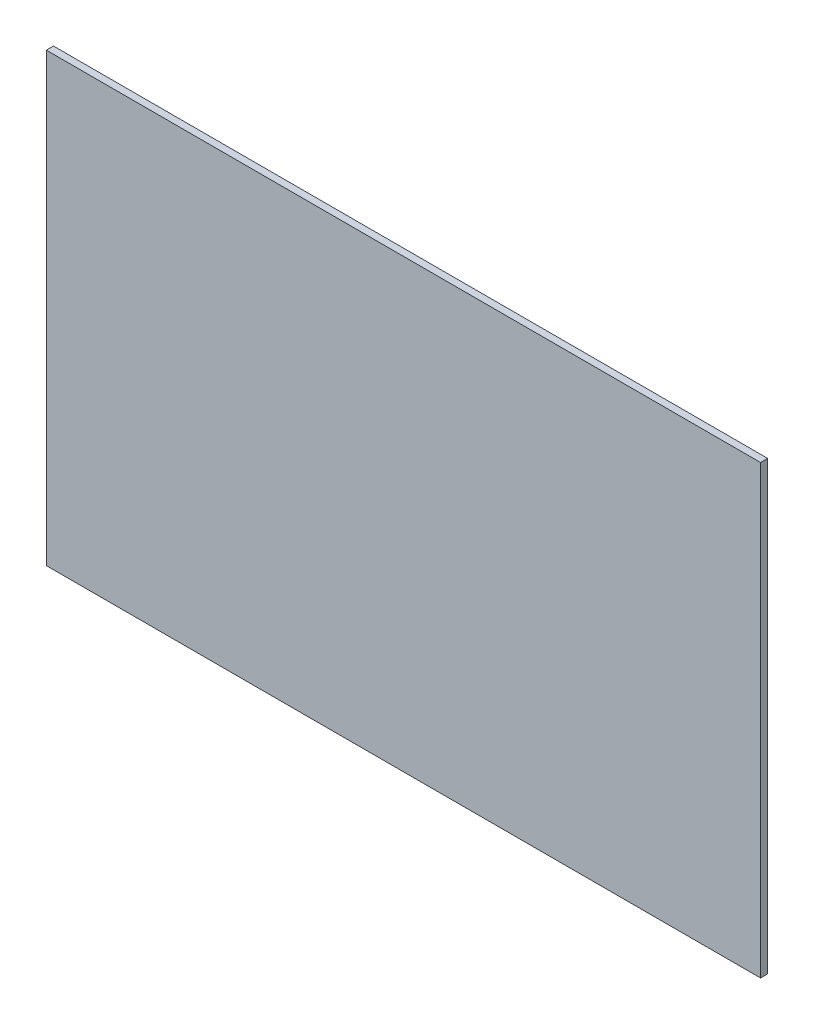
ISO-10303-21;
HEADER;
FILE_DESCRIPTION(('STEP AP214'),'2;1');
FILE_NAME('part.step','',(''),(''),'','','');
FILE_SCHEMA(('AUTOMOTIVE_DESIGN { 1 0 10303 214 1 1 1 1 }'));
ENDSEC;
DATA;
#1=APPLICATION_CONTEXT('core data for automotive mechanical design processes');
#2=APPLICATION_PROTOCOL_DEFINITION('international standard','automotive_design',2000,#1);
#3=PRODUCT_CONTEXT('',#1,'mechanical');
#4=PRODUCT('Part','Part','',(#3));
#5=PRODUCT_RELATED_PRODUCT_CATEGORY('part','',(#4));
#6=PRODUCT_DEFINITION_FORMATION('','',#4);
#7=PRODUCT_DEFINITION_CONTEXT('part definition',#1,'design');
#8=PRODUCT_DEFINITION('design','',#6,#7);
#9=PRODUCT_DEFINITION_SHAPE('','',#8);
#10=(LENGTH_UNIT() NAMED_UNIT(*) SI_UNIT(.MILLI.,.METRE.));
#11=(NAMED_UNIT(*) PLANE_ANGLE_UNIT() SI_UNIT($,.RADIAN.));
#12=(NAMED_UNIT(*) SI_UNIT($,.STERADIAN.) SOLID_ANGLE_UNIT());
#13=UNCERTAINTY_MEASURE_WITH_UNIT(LENGTH_MEASURE(1.E-05),#10,'distance_accuracy_value','');
#14=(GEOMETRIC_REPRESENTATION_CONTEXT(3) GLOBAL_UNCERTAINTY_ASSIGNED_CONTEXT((#13)) GLOBAL_UNIT_ASSIGNED_CONTEXT((#10,
#11,#12)) REPRESENTATION_CONTEXT('',''));
#15=CARTESIAN_POINT('',(0.,0.,0.));
#16=DIRECTION('',(0.,0.,1.));
#17=DIRECTION('',(1.,0.,0.));
#18=AXIS2_PLACEMENT_3D('',#15,#16,#17);
#19=CARTESIAN_POINT('',(0.,0.,0.508));
#20=DIRECTION('',(1.,0.,0.));
#21=DIRECTION('',(0.,1.,0.));
#22=AXIS2_PLACEMENT_3D('',#19,#20,#21);
#23=PLANE('',#22);
#24=DIRECTION('',(0.,-1.,0.));
#25=VECTOR('',#24,1.);
#26=CARTESIAN_POINT('',(0.,0.,0.));
#27=LINE('',#26,#25);
#28=CARTESIAN_POINT('',(0.,31.75,0.));
#29=VERTEX_POINT('',#28);
#30=CARTESIAN_POINT('',(0.,0.,0.));
#31=VERTEX_POINT('',#30);
#32=EDGE_CURVE('E107',#29,#31,#27,.T.);
#33=ORIENTED_EDGE('',*,*,#32,.T.);
#34=DIRECTION('',(0.,0.,-1.));
#35=VECTOR('',#34,1.);
#36=CARTESIAN_POINT('',(0.,0.,0.508));
#37=LINE('',#36,#35);
#38=CARTESIAN_POINT('',(0.,0.,0.508));
#39=VERTEX_POINT('',#38);
#40=EDGE_CURVE('E11',#39,#31,#37,.T.);
#41=ORIENTED_EDGE('',*,*,#40,.F.);
#42=DIRECTION('',(0.,-1.,0.));
#43=VECTOR('',#42,1.);
#44=CARTESIAN_POINT('',(0.,0.,0.508));
#45=LINE('',#44,#43);
#46=CARTESIAN_POINT('',(0.,31.75,0.508));
#47=VERTEX_POINT('',#46);
#48=EDGE_CURVE('E91',#47,#39,#45,.T.);
#49=ORIENTED_EDGE('',*,*,#48,.F.);
#50=DIRECTION('',(0.,0.,-1.));
#51=VECTOR('',#50,1.);
#52=CARTESIAN_POINT('',(0.,31.75,0.508));
#53=LINE('',#52,#51);
#54=EDGE_CURVE('E103',#47,#29,#53,.T.);
#55=ORIENTED_EDGE('',*,*,#54,.T.);
#56=EDGE_LOOP('',(#33,#41,#49,#55));
#57=FACE_BOUND('',#56,.T.);
#58=ADVANCED_FACE('F39',(#57),#23,.F.);
#59=CARTESIAN_POINT('',(0.,0.,0.508));
#60=DIRECTION('',(0.,1.,0.));
#61=DIRECTION('',(0.,0.,1.));
#62=AXIS2_PLACEMENT_3D('',#59,#60,#61);
#63=PLANE('',#62);
#64=DIRECTION('',(1.,0.,0.));
#65=VECTOR('',#64,1.);
#66=CARTESIAN_POINT('',(0.,0.,0.));
#67=LINE('',#66,#65);
#68=CARTESIAN_POINT('',(50.8,0.,0.));
#69=VERTEX_POINT('',#68);
#70=EDGE_CURVE('E96',#31,#69,#67,.T.);
#71=ORIENTED_EDGE('',*,*,#70,.T.);
#72=DIRECTION('',(0.,0.,-1.));
#73=VECTOR('',#72,1.);
#74=CARTESIAN_POINT('',(50.8,0.,0.508));
#75=LINE('',#74,#73);
#76=CARTESIAN_POINT('',(50.8,0.,0.508));
#77=VERTEX_POINT('',#76);
#78=EDGE_CURVE('E48',#77,#69,#75,.T.);
#79=ORIENTED_EDGE('',*,*,#78,.F.);
#80=DIRECTION('',(1.,0.,0.));
#81=VECTOR('',#80,1.);
#82=CARTESIAN_POINT('',(0.,0.,0.508));
#83=LINE('',#82,#81);
#84=EDGE_CURVE('E86',#39,#77,#83,.T.);
#85=ORIENTED_EDGE('',*,*,#84,.F.);
#86=ORIENTED_EDGE('',*,*,#40,.T.);
#87=EDGE_LOOP('',(#71,#79,#85,#86));
#88=FACE_BOUND('',#87,.T.);
#89=ADVANCED_FACE('F95',(#88),#63,.F.);
#90=CARTESIAN_POINT('',(50.8,0.,0.508));
#91=DIRECTION('',(-1.,0.,0.));
#92=DIRECTION('',(0.,-1.,0.));
#93=AXIS2_PLACEMENT_3D('',#90,#91,#92);
#94=PLANE('',#93);
#95=DIRECTION('',(0.,1.,0.));
#96=VECTOR('',#95,1.);
#97=CARTESIAN_POINT('',(50.8,0.,0.));
#98=LINE('',#97,#96);
#99=CARTESIAN_POINT('',(50.8,31.75,0.));
#100=VERTEX_POINT('',#99);
#101=EDGE_CURVE('E73',#69,#100,#98,.T.);
#102=ORIENTED_EDGE('',*,*,#101,.T.);
#103=DIRECTION('',(0.,0.,-1.));
#104=VECTOR('',#103,1.);
#105=CARTESIAN_POINT('',(50.8,31.75,0.508));
#106=LINE('',#105,#104);
#107=CARTESIAN_POINT('',(50.8,31.75,0.508));
#108=VERTEX_POINT('',#107);
#109=EDGE_CURVE('E98',#108,#100,#106,.T.);
#110=ORIENTED_EDGE('',*,*,#109,.F.);
#111=DIRECTION('',(0.,1.,0.));
#112=VECTOR('',#111,1.);
#113=CARTESIAN_POINT('',(50.8,0.,0.508));
#114=LINE('',#113,#112);
#115=EDGE_CURVE('E89',#77,#108,#114,.T.);
#116=ORIENTED_EDGE('',*,*,#115,.F.);
#117=ORIENTED_EDGE('',*,*,#78,.T.);
#118=EDGE_LOOP('',(#102,#110,#116,#117));
#119=FACE_BOUND('',#118,.T.);
#120=ADVANCED_FACE('F99',(#119),#94,.F.);
#121=CARTESIAN_POINT('',(0.,31.75,0.508));
#122=DIRECTION('',(0.,-1.,0.));
#123=DIRECTION('',(0.,0.,-1.));
#124=AXIS2_PLACEMENT_3D('',#121,#122,#123);
#125=PLANE('',#124);
#126=DIRECTION('',(-1.,0.,0.));
#127=VECTOR('',#126,1.);
#128=CARTESIAN_POINT('',(0.,31.75,0.));
#129=LINE('',#128,#127);
#130=EDGE_CURVE('E79',#100,#29,#129,.T.);
#131=ORIENTED_EDGE('',*,*,#130,.T.);
#132=ORIENTED_EDGE('',*,*,#54,.F.);
#133=DIRECTION('',(-1.,0.,0.));
#134=VECTOR('',#133,1.);
#135=CARTESIAN_POINT('',(0.,31.75,0.508));
#136=LINE('',#135,#134);
#137=EDGE_CURVE('E56',#108,#47,#136,.T.);
#138=ORIENTED_EDGE('',*,*,#137,.F.);
#139=ORIENTED_EDGE('',*,*,#109,.T.);
#140=EDGE_LOOP('',(#131,#132,#138,#139));
#141=FACE_BOUND('',#140,.T.);
#142=ADVANCED_FACE('F120',(#141),#125,.F.);
#143=CARTESIAN_POINT('',(0.,0.,0.508));
#144=DIRECTION('',(0.,0.,-1.));
#145=DIRECTION('',(-1.,0.,0.));
#146=AXIS2_PLACEMENT_3D('',#143,#144,#145);
#147=PLANE('',#146);
#148=ORIENTED_EDGE('',*,*,#48,.T.);
#149=ORIENTED_EDGE('',*,*,#84,.T.);
#150=ORIENTED_EDGE('',*,*,#115,.T.);
#151=ORIENTED_EDGE('',*,*,#137,.T.);
#152=EDGE_LOOP('',(#148,#149,#150,#151));
#153=FACE_BOUND('',#152,.T.);
#154=ADVANCED_FACE('F87',(#153),#147,.F.);
#155=CARTESIAN_POINT('',(0.,0.,0.));
#156=DIRECTION('',(0.,0.,-1.));
#157=DIRECTION('',(-1.,0.,0.));
#158=AXIS2_PLACEMENT_3D('',#155,#156,#157);
#159=PLANE('',#158);
#160=ORIENTED_EDGE('',*,*,#32,.F.);
#161=ORIENTED_EDGE('',*,*,#130,.F.);
#162=ORIENTED_EDGE('',*,*,#101,.F.);
#163=ORIENTED_EDGE('',*,*,#70,.F.);
#164=EDGE_LOOP('',(#160,#161,#162,#163));
#165=FACE_BOUND('',#164,.T.);
#166=ADVANCED_FACE('F123',(#165),#159,.T.);
#167=CLOSED_SHELL('',(#58,#89,#120,#142,#154,#166));
#168=MANIFOLD_SOLID_BREP('B2',#167);
#169=ADVANCED_BREP_SHAPE_REPRESENTATION('',(#18,#168),#14);
#170=SHAPE_DEFINITION_REPRESENTATION(#9,#169);
ENDSEC;
END-ISO-10303-21;
